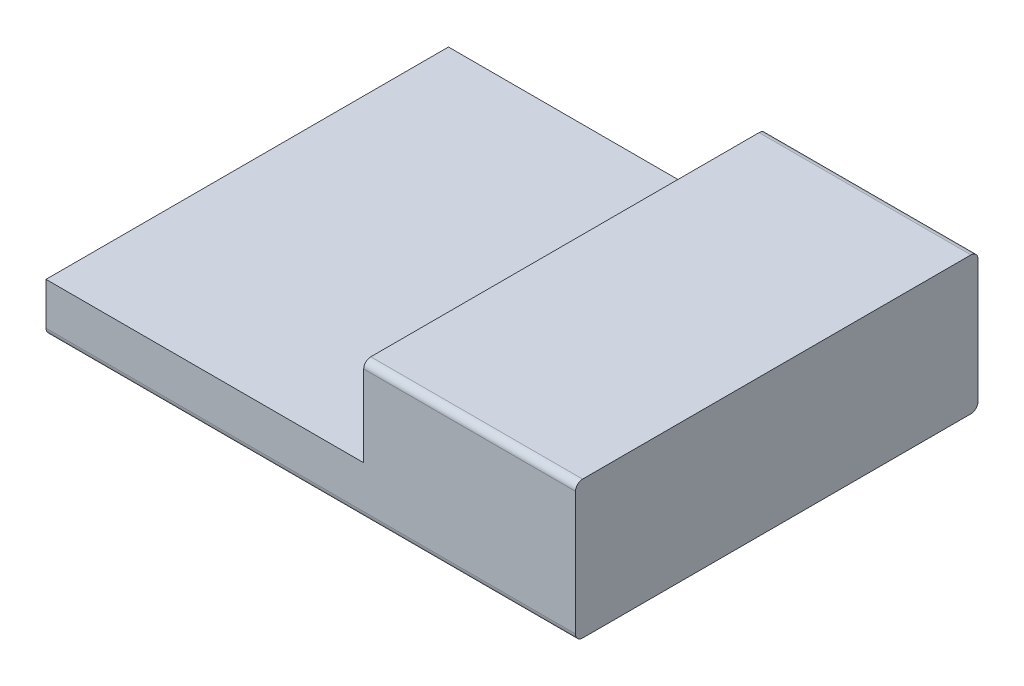
ISO-10303-21;
HEADER;
FILE_DESCRIPTION(('STEP AP214'),'2;1');
FILE_NAME('part.step','',(''),(''),'','','');
FILE_SCHEMA(('AUTOMOTIVE_DESIGN { 1 0 10303 214 1 1 1 1 }'));
ENDSEC;
DATA;
#1=APPLICATION_CONTEXT('core data for automotive mechanical design processes');
#2=APPLICATION_PROTOCOL_DEFINITION('international standard','automotive_design',2000,#1);
#3=PRODUCT_CONTEXT('',#1,'mechanical');
#4=PRODUCT('Part','Part','',(#3));
#5=PRODUCT_RELATED_PRODUCT_CATEGORY('part','',(#4));
#6=PRODUCT_DEFINITION_FORMATION('','',#4);
#7=PRODUCT_DEFINITION_CONTEXT('part definition',#1,'design');
#8=PRODUCT_DEFINITION('design','',#6,#7);
#9=PRODUCT_DEFINITION_SHAPE('','',#8);
#10=(LENGTH_UNIT() NAMED_UNIT(*) SI_UNIT(.MILLI.,.METRE.));
#11=(NAMED_UNIT(*) PLANE_ANGLE_UNIT() SI_UNIT($,.RADIAN.));
#12=(NAMED_UNIT(*) SI_UNIT($,.STERADIAN.) SOLID_ANGLE_UNIT());
#13=UNCERTAINTY_MEASURE_WITH_UNIT(LENGTH_MEASURE(1.E-05),#10,'distance_accuracy_value','');
#14=(GEOMETRIC_REPRESENTATION_CONTEXT(3) GLOBAL_UNCERTAINTY_ASSIGNED_CONTEXT((#13)) GLOBAL_UNIT_ASSIGNED_CONTEXT((#10,
#11,#12)) REPRESENTATION_CONTEXT('',''));
#15=CARTESIAN_POINT('',(0.,0.,0.));
#16=DIRECTION('',(0.,0.,1.));
#17=DIRECTION('',(1.,0.,0.));
#18=AXIS2_PLACEMENT_3D('',#15,#16,#17);
#19=CARTESIAN_POINT('',(17.951348623187,4.00000000001,30.5));
#20=DIRECTION('',(1.,-3.547898225946E-13,0.));
#21=DIRECTION('',(3.547898225946E-13,1.,0.));
#22=AXIS2_PLACEMENT_3D('',#19,#20,#21);
#23=CYLINDRICAL_SURFACE('',#22,0.2);
#24=DIRECTION('',(1.,-3.547898225946E-13,0.));
#25=VECTOR('',#24,1.);
#26=CARTESIAN_POINT('',(17.951348623187,4.00000000001,30.3));
#27=LINE('',#26,#25);
#28=CARTESIAN_POINT('',(39.,4.00000000001,30.3));
#29=VERTEX_POINT('',#28);
#30=CARTESIAN_POINT('',(45.000000521542,4.,30.3));
#31=VERTEX_POINT('',#30);
#32=EDGE_CURVE('E216',#29,#31,#27,.T.);
#33=ORIENTED_EDGE('',*,*,#32,.F.);
#34=CARTESIAN_POINT('',(39.,4.000000000002,30.5));
#35=DIRECTION('',(1.,0.,0.));
#36=DIRECTION('',(0.,0.,-1.));
#37=AXIS2_PLACEMENT_3D('',#34,#35,#36);
#38=CIRCLE('',#37,0.2);
#39=CARTESIAN_POINT('',(39.,4.200000000002,30.5));
#40=VERTEX_POINT('',#39);
#41=EDGE_CURVE('E196',#29,#40,#38,.T.);
#42=ORIENTED_EDGE('',*,*,#41,.T.);
#43=DIRECTION('',(1.,-3.547898225946E-13,0.));
#44=VECTOR('',#43,1.);
#45=CARTESIAN_POINT('',(17.951348623187,4.20000000001,30.5));
#46=LINE('',#45,#44);
#47=CARTESIAN_POINT('',(45.000000521542,4.2,30.5));
#48=VERTEX_POINT('',#47);
#49=EDGE_CURVE('E11',#40,#48,#46,.T.);
#50=ORIENTED_EDGE('',*,*,#49,.T.);
#51=CARTESIAN_POINT('',(45.000000521542,4.,30.5));
#52=DIRECTION('',(-1.,3.547576892287E-13,0.));
#53=DIRECTION('',(3.547576892287E-13,1.,0.));
#54=AXIS2_PLACEMENT_3D('',#51,#52,#53);
#55=CIRCLE('',#54,0.2);
#56=EDGE_CURVE('E202',#48,#31,#55,.T.);
#57=ORIENTED_EDGE('',*,*,#56,.T.);
#58=EDGE_LOOP('',(#33,#42,#50,#57));
#59=FACE_BOUND('',#58,.T.);
#60=ADVANCED_FACE('F17',(#59),#23,.T.);
#61=CARTESIAN_POINT('',(17.951348623187,4.20000000001,0.));
#62=DIRECTION('',(-3.547898225946E-13,-1.,0.));
#63=DIRECTION('',(-1.,3.547898225946E-13,0.));
#64=AXIS2_PLACEMENT_3D('',#61,#62,#63);
#65=PLANE('',#64);
#66=ORIENTED_EDGE('',*,*,#49,.F.);
#67=DIRECTION('',(0.,0.,1.));
#68=VECTOR('',#67,1.);
#69=CARTESIAN_POINT('',(39.,4.200000000002,0.));
#70=LINE('',#69,#68);
#71=CARTESIAN_POINT('',(39.,4.200000000002,41.5));
#72=VERTEX_POINT('',#71);
#73=EDGE_CURVE('E193',#40,#72,#70,.T.);
#74=ORIENTED_EDGE('',*,*,#73,.T.);
#75=DIRECTION('',(1.,-3.547898225946E-13,0.));
#76=VECTOR('',#75,1.);
#77=CARTESIAN_POINT('',(17.951348623187,4.20000000001,41.5));
#78=LINE('',#77,#76);
#79=CARTESIAN_POINT('',(45.000000521542,4.2,41.5));
#80=VERTEX_POINT('',#79);
#81=EDGE_CURVE('E28',#72,#80,#78,.T.);
#82=ORIENTED_EDGE('',*,*,#81,.T.);
#83=DIRECTION('',(0.,0.,-1.));
#84=VECTOR('',#83,1.);
#85=CARTESIAN_POINT('',(45.000000521542,4.2,0.));
#86=LINE('',#85,#84);
#87=EDGE_CURVE('E198',#80,#48,#86,.T.);
#88=ORIENTED_EDGE('',*,*,#87,.T.);
#89=EDGE_LOOP('',(#66,#74,#82,#88));
#90=FACE_BOUND('',#89,.T.);
#91=ADVANCED_FACE('F253',(#90),#65,.F.);
#92=CARTESIAN_POINT('',(17.951348623187,4.00000000001,41.5));
#93=DIRECTION('',(1.,-3.547898225946E-13,0.));
#94=DIRECTION('',(3.547898225946E-13,1.,0.));
#95=AXIS2_PLACEMENT_3D('',#92,#93,#94);
#96=CYLINDRICAL_SURFACE('',#95,0.2);
#97=CARTESIAN_POINT('',(39.,4.000000000002,41.5));
#98=DIRECTION('',(-1.,0.,0.));
#99=DIRECTION('',(0.,0.,-1.));
#100=AXIS2_PLACEMENT_3D('',#97,#98,#99);
#101=CIRCLE('',#100,0.2);
#102=CARTESIAN_POINT('',(39.,4.000000000005,41.7));
#103=VERTEX_POINT('',#102);
#104=EDGE_CURVE('E197',#103,#72,#101,.T.);
#105=ORIENTED_EDGE('',*,*,#104,.F.);
#106=DIRECTION('',(1.,-3.547898225946E-13,0.));
#107=VECTOR('',#106,1.);
#108=CARTESIAN_POINT('',(17.951348623187,4.00000000001,41.7));
#109=LINE('',#108,#107);
#110=CARTESIAN_POINT('',(45.000000521542,4.,41.7));
#111=VERTEX_POINT('',#110);
#112=EDGE_CURVE('E171',#103,#111,#109,.T.);
#113=ORIENTED_EDGE('',*,*,#112,.T.);
#114=CARTESIAN_POINT('',(45.000000521542,4.,41.5));
#115=DIRECTION('',(1.,-3.547576892287E-13,0.));
#116=DIRECTION('',(3.547576892287E-13,1.,0.));
#117=AXIS2_PLACEMENT_3D('',#114,#115,#116);
#118=CIRCLE('',#117,0.2);
#119=EDGE_CURVE('E201',#80,#111,#118,.T.);
#120=ORIENTED_EDGE('',*,*,#119,.F.);
#121=ORIENTED_EDGE('',*,*,#81,.F.);
#122=EDGE_LOOP('',(#105,#113,#120,#121));
#123=FACE_BOUND('',#122,.T.);
#124=ADVANCED_FACE('F257',(#123),#96,.T.);
#125=CARTESIAN_POINT('',(39.,2.25,36.));
#126=DIRECTION('',(1.,0.,0.));
#127=DIRECTION('',(0.,1.,0.));
#128=AXIS2_PLACEMENT_3D('',#125,#126,#127);
#129=PLANE('',#128);
#130=DIRECTION('',(0.,-1.,0.));
#131=VECTOR('',#130,1.);
#132=CARTESIAN_POINT('',(39.,-6.367509791872E-12,30.3));
#133=LINE('',#132,#131);
#134=CARTESIAN_POINT('',(39.,1.700000014901,30.3));
#135=VERTEX_POINT('',#134);
#136=EDGE_CURVE('E143',#29,#135,#133,.T.);
#137=ORIENTED_EDGE('',*,*,#136,.T.);
#138=DIRECTION('',(0.,0.,1.));
#139=VECTOR('',#138,1.);
#140=CARTESIAN_POINT('',(39.,1.700000014901,0.));
#141=LINE('',#140,#139);
#142=CARTESIAN_POINT('',(39.,1.7,41.7));
#143=VERTEX_POINT('',#142);
#144=EDGE_CURVE('E172',#135,#143,#141,.T.);
#145=ORIENTED_EDGE('',*,*,#144,.T.);
#146=DIRECTION('',(0.,1.,0.));
#147=VECTOR('',#146,1.);
#148=CARTESIAN_POINT('',(39.,-6.126383231705E-12,41.7));
#149=LINE('',#148,#147);
#150=EDGE_CURVE('E82',#143,#103,#149,.T.);
#151=ORIENTED_EDGE('',*,*,#150,.T.);
#152=ORIENTED_EDGE('',*,*,#104,.T.);
#153=ORIENTED_EDGE('',*,*,#73,.F.);
#154=ORIENTED_EDGE('',*,*,#41,.F.);
#155=EDGE_LOOP('',(#137,#145,#151,#152,#153,#154));
#156=FACE_BOUND('',#155,.T.);
#157=ADVANCED_FACE('F252',(#156),#129,.F.);
#158=CARTESIAN_POINT('',(45.000000521541,0.7,36.000000745058));
#159=DIRECTION('',(1.,-3.547898225946E-13,0.));
#160=DIRECTION('',(-3.547898225946E-13,-1.,0.));
#161=AXIS2_PLACEMENT_3D('',#158,#159,#160);
#162=PLANE('',#161);
#163=DIRECTION('',(0.,0.,-1.));
#164=VECTOR('',#163,1.);
#165=CARTESIAN_POINT('',(45.000000521541,0.3,0.));
#166=LINE('',#165,#164);
#167=CARTESIAN_POINT('',(45.000000521541,0.3,41.5));
#168=VERTEX_POINT('',#167);
#169=CARTESIAN_POINT('',(45.000000521541,0.3,30.5));
#170=VERTEX_POINT('',#169);
#171=EDGE_CURVE('E106',#168,#170,#166,.T.);
#172=ORIENTED_EDGE('',*,*,#171,.T.);
#173=CARTESIAN_POINT('',(45.000000521541,0.5,30.5));
#174=DIRECTION('',(1.,-3.547898225946E-13,0.));
#175=DIRECTION('',(3.547898225946E-13,1.,0.));
#176=AXIS2_PLACEMENT_3D('',#173,#174,#175);
#177=CIRCLE('',#176,0.2);
#178=CARTESIAN_POINT('',(45.000000521541,0.5,30.3));
#179=VERTEX_POINT('',#178);
#180=EDGE_CURVE('E144',#170,#179,#177,.T.);
#181=ORIENTED_EDGE('',*,*,#180,.T.);
#182=DIRECTION('',(3.547898225946E-13,1.,0.));
#183=VECTOR('',#182,1.);
#184=CARTESIAN_POINT('',(45.000000521541,4.074989318318E-12,30.3));
#185=LINE('',#184,#183);
#186=EDGE_CURVE('E151',#179,#31,#185,.T.);
#187=ORIENTED_EDGE('',*,*,#186,.T.);
#188=ORIENTED_EDGE('',*,*,#56,.F.);
#189=ORIENTED_EDGE('',*,*,#87,.F.);
#190=ORIENTED_EDGE('',*,*,#119,.T.);
#191=DIRECTION('',(3.547898225946E-13,1.,0.));
#192=VECTOR('',#191,1.);
#193=CARTESIAN_POINT('',(45.000000521541,4.316115878484E-12,41.7));
#194=LINE('',#193,#192);
#195=CARTESIAN_POINT('',(45.000000521541,0.5,41.7));
#196=VERTEX_POINT('',#195);
#197=EDGE_CURVE('E169',#196,#111,#194,.T.);
#198=ORIENTED_EDGE('',*,*,#197,.F.);
#199=CARTESIAN_POINT('',(45.000000521541,0.5,41.5));
#200=DIRECTION('',(-1.,3.547898225946E-13,0.));
#201=DIRECTION('',(3.547898225946E-13,1.,0.));
#202=AXIS2_PLACEMENT_3D('',#199,#200,#201);
#203=CIRCLE('',#202,0.2);
#204=EDGE_CURVE('E205',#168,#196,#203,.T.);
#205=ORIENTED_EDGE('',*,*,#204,.F.);
#206=EDGE_LOOP('',(#172,#181,#187,#188,#189,#190,#198,#205));
#207=FACE_BOUND('',#206,.T.);
#208=ADVANCED_FACE('F245',(#207),#162,.T.);
#209=CARTESIAN_POINT('',(30.,0.,0.));
#210=DIRECTION('',(-1.,0.,0.));
#211=DIRECTION('',(0.,0.,1.));
#212=AXIS2_PLACEMENT_3D('',#209,#210,#211);
#213=PLANE('',#212);
#214=CARTESIAN_POINT('',(30.,0.5,30.5));
#215=DIRECTION('',(1.,0.,0.));
#216=DIRECTION('',(0.,0.,1.));
#217=AXIS2_PLACEMENT_3D('',#214,#215,#216);
#218=CIRCLE('',#217,0.2);
#219=CARTESIAN_POINT('',(30.,0.3,30.5));
#220=VERTEX_POINT('',#219);
#221=CARTESIAN_POINT('',(30.,0.5,30.3));
#222=VERTEX_POINT('',#221);
#223=EDGE_CURVE('E137',#220,#222,#218,.T.);
#224=ORIENTED_EDGE('',*,*,#223,.F.);
#225=DIRECTION('',(0.,0.,-1.));
#226=VECTOR('',#225,1.);
#227=CARTESIAN_POINT('',(30.,0.3,0.));
#228=LINE('',#227,#226);
#229=CARTESIAN_POINT('',(30.,0.3,41.5));
#230=VERTEX_POINT('',#229);
#231=EDGE_CURVE('E117',#230,#220,#228,.T.);
#232=ORIENTED_EDGE('',*,*,#231,.F.);
#233=CARTESIAN_POINT('',(30.,0.5,41.5));
#234=DIRECTION('',(-1.,0.,0.));
#235=DIRECTION('',(0.,0.,1.));
#236=AXIS2_PLACEMENT_3D('',#233,#234,#235);
#237=CIRCLE('',#236,0.2);
#238=CARTESIAN_POINT('',(30.,0.5,41.7));
#239=VERTEX_POINT('',#238);
#240=EDGE_CURVE('E21',#230,#239,#237,.T.);
#241=ORIENTED_EDGE('',*,*,#240,.T.);
#242=DIRECTION('',(0.,1.,0.));
#243=VECTOR('',#242,1.);
#244=CARTESIAN_POINT('',(30.,2.411265601665E-13,41.7));
#245=LINE('',#244,#243);
#246=CARTESIAN_POINT('',(30.,1.7,41.7));
#247=VERTEX_POINT('',#246);
#248=EDGE_CURVE('E192',#239,#247,#245,.T.);
#249=ORIENTED_EDGE('',*,*,#248,.T.);
#250=DIRECTION('',(0.,0.,1.));
#251=VECTOR('',#250,1.);
#252=CARTESIAN_POINT('',(30.,1.700000014901,0.));
#253=LINE('',#252,#251);
#254=CARTESIAN_POINT('',(30.,1.700000014901,30.3));
#255=VERTEX_POINT('',#254);
#256=EDGE_CURVE('E140',#255,#247,#253,.T.);
#257=ORIENTED_EDGE('',*,*,#256,.F.);
#258=DIRECTION('',(0.,1.,0.));
#259=VECTOR('',#258,1.);
#260=CARTESIAN_POINT('',(30.,0.,30.3));
#261=LINE('',#260,#259);
#262=EDGE_CURVE('E94',#222,#255,#261,.T.);
#263=ORIENTED_EDGE('',*,*,#262,.F.);
#264=EDGE_LOOP('',(#224,#232,#241,#249,#257,#263));
#265=FACE_BOUND('',#264,.T.);
#266=ADVANCED_FACE('F135',(#265),#213,.T.);
#267=CARTESIAN_POINT('',(56.485643735646,0.3,0.));
#268=DIRECTION('',(0.,1.,0.));
#269=DIRECTION('',(1.,0.,0.));
#270=AXIS2_PLACEMENT_3D('',#267,#268,#269);
#271=PLANE('',#270);
#272=DIRECTION('',(-1.,0.,0.));
#273=VECTOR('',#272,1.);
#274=CARTESIAN_POINT('',(56.485643735646,0.3,41.5));
#275=LINE('',#274,#273);
#276=EDGE_CURVE('E211',#168,#230,#275,.T.);
#277=ORIENTED_EDGE('',*,*,#276,.T.);
#278=ORIENTED_EDGE('',*,*,#231,.T.);
#279=DIRECTION('',(-1.,0.,0.));
#280=VECTOR('',#279,1.);
#281=CARTESIAN_POINT('',(56.485643735646,0.3,30.5));
#282=LINE('',#281,#280);
#283=EDGE_CURVE('E158',#170,#220,#282,.T.);
#284=ORIENTED_EDGE('',*,*,#283,.F.);
#285=ORIENTED_EDGE('',*,*,#171,.F.);
#286=EDGE_LOOP('',(#277,#278,#284,#285));
#287=FACE_BOUND('',#286,.T.);
#288=ADVANCED_FACE('F269',(#287),#271,.F.);
#289=CARTESIAN_POINT('',(56.485643735646,0.5,41.5));
#290=DIRECTION('',(-1.,0.,0.));
#291=DIRECTION('',(0.,0.,1.));
#292=AXIS2_PLACEMENT_3D('',#289,#290,#291);
#293=CYLINDRICAL_SURFACE('',#292,0.2);
#294=DIRECTION('',(-1.,0.,0.));
#295=VECTOR('',#294,1.);
#296=CARTESIAN_POINT('',(56.485643735646,0.5,41.7));
#297=LINE('',#296,#295);
#298=EDGE_CURVE('E190',#196,#239,#297,.T.);
#299=ORIENTED_EDGE('',*,*,#298,.T.);
#300=ORIENTED_EDGE('',*,*,#240,.F.);
#301=ORIENTED_EDGE('',*,*,#276,.F.);
#302=ORIENTED_EDGE('',*,*,#204,.T.);
#303=EDGE_LOOP('',(#299,#300,#301,#302));
#304=FACE_BOUND('',#303,.T.);
#305=ADVANCED_FACE('F19',(#304),#293,.T.);
#306=CARTESIAN_POINT('',(56.485643735646,2.411265601665E-13,41.7));
#307=DIRECTION('',(0.,0.,1.));
#308=DIRECTION('',(0.,-1.,0.));
#309=AXIS2_PLACEMENT_3D('',#306,#307,#308);
#310=PLANE('',#309);
#311=ORIENTED_EDGE('',*,*,#197,.T.);
#312=ORIENTED_EDGE('',*,*,#112,.F.);
#313=ORIENTED_EDGE('',*,*,#150,.F.);
#314=DIRECTION('',(-1.,0.,0.));
#315=VECTOR('',#314,1.);
#316=CARTESIAN_POINT('',(56.485643735646,1.7,41.7));
#317=LINE('',#316,#315);
#318=EDGE_CURVE('E165',#143,#247,#317,.T.);
#319=ORIENTED_EDGE('',*,*,#318,.T.);
#320=ORIENTED_EDGE('',*,*,#248,.F.);
#321=ORIENTED_EDGE('',*,*,#298,.F.);
#322=EDGE_LOOP('',(#311,#312,#313,#319,#320,#321));
#323=FACE_BOUND('',#322,.T.);
#324=ADVANCED_FACE('F268',(#323),#310,.T.);
#325=CARTESIAN_POINT('',(56.485643735646,0.,30.3));
#326=DIRECTION('',(0.,0.,1.));
#327=DIRECTION('',(1.,0.,0.));
#328=AXIS2_PLACEMENT_3D('',#325,#326,#327);
#329=PLANE('',#328);
#330=DIRECTION('',(-1.,0.,0.));
#331=VECTOR('',#330,1.);
#332=CARTESIAN_POINT('',(56.485643735646,0.5,30.3));
#333=LINE('',#332,#331);
#334=EDGE_CURVE('E147',#179,#222,#333,.T.);
#335=ORIENTED_EDGE('',*,*,#334,.T.);
#336=ORIENTED_EDGE('',*,*,#262,.T.);
#337=DIRECTION('',(-1.,0.,0.));
#338=VECTOR('',#337,1.);
#339=CARTESIAN_POINT('',(56.485643735646,1.700000014901,30.3));
#340=LINE('',#339,#338);
#341=EDGE_CURVE('E175',#135,#255,#340,.T.);
#342=ORIENTED_EDGE('',*,*,#341,.F.);
#343=ORIENTED_EDGE('',*,*,#136,.F.);
#344=ORIENTED_EDGE('',*,*,#32,.T.);
#345=ORIENTED_EDGE('',*,*,#186,.F.);
#346=EDGE_LOOP('',(#335,#336,#342,#343,#344,#345));
#347=FACE_BOUND('',#346,.T.);
#348=ADVANCED_FACE('F148',(#347),#329,.F.);
#349=CARTESIAN_POINT('',(56.485643735646,0.5,30.5));
#350=DIRECTION('',(-1.,0.,0.));
#351=DIRECTION('',(0.,0.,1.));
#352=AXIS2_PLACEMENT_3D('',#349,#350,#351);
#353=CYLINDRICAL_SURFACE('',#352,0.2);
#354=ORIENTED_EDGE('',*,*,#283,.T.);
#355=ORIENTED_EDGE('',*,*,#223,.T.);
#356=ORIENTED_EDGE('',*,*,#334,.F.);
#357=ORIENTED_EDGE('',*,*,#180,.F.);
#358=EDGE_LOOP('',(#354,#355,#356,#357));
#359=FACE_BOUND('',#358,.T.);
#360=ADVANCED_FACE('F157',(#359),#353,.T.);
#361=CARTESIAN_POINT('',(56.485643735646,1.700000014901,0.));
#362=DIRECTION('',(0.,-1.,0.));
#363=DIRECTION('',(0.,0.,-1.));
#364=AXIS2_PLACEMENT_3D('',#361,#362,#363);
#365=PLANE('',#364);
#366=ORIENTED_EDGE('',*,*,#144,.F.);
#367=ORIENTED_EDGE('',*,*,#341,.T.);
#368=ORIENTED_EDGE('',*,*,#256,.T.);
#369=ORIENTED_EDGE('',*,*,#318,.F.);
#370=EDGE_LOOP('',(#366,#367,#368,#369));
#371=FACE_BOUND('',#370,.T.);
#372=ADVANCED_FACE('F281',(#371),#365,.F.);
#373=CLOSED_SHELL('',(#60,#91,#124,#157,#208,#266,#288,#305,#324,#348,#360,#372));
#374=MANIFOLD_SOLID_BREP('B1',#373);
#375=ADVANCED_BREP_SHAPE_REPRESENTATION('',(#18,#374),#14);
#376=SHAPE_DEFINITION_REPRESENTATION(#9,#375);
ENDSEC;
END-ISO-10303-21;
